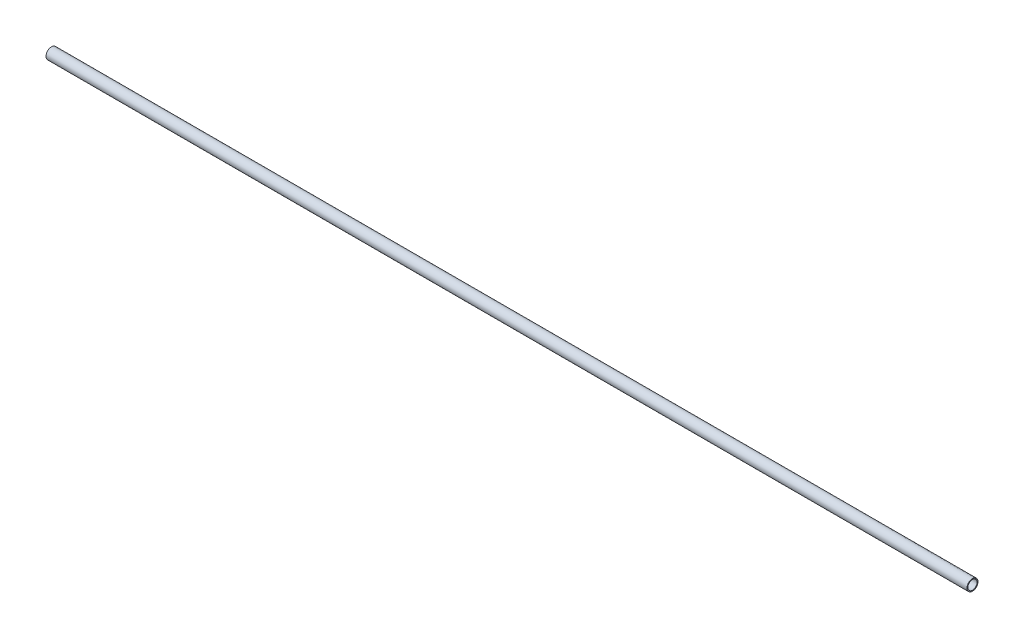
ISO-10303-21;
HEADER;
FILE_DESCRIPTION(('STEP AP214'),'2;1');
FILE_NAME('part.step','',(''),(''),'','','');
FILE_SCHEMA(('AUTOMOTIVE_DESIGN { 1 0 10303 214 1 1 1 1 }'));
ENDSEC;
DATA;
#1=APPLICATION_CONTEXT('core data for automotive mechanical design processes');
#2=APPLICATION_PROTOCOL_DEFINITION('international standard','automotive_design',2000,#1);
#3=PRODUCT_CONTEXT('',#1,'mechanical');
#4=PRODUCT('Part','Part','',(#3));
#5=PRODUCT_RELATED_PRODUCT_CATEGORY('part','',(#4));
#6=PRODUCT_DEFINITION_FORMATION('','',#4);
#7=PRODUCT_DEFINITION_CONTEXT('part definition',#1,'design');
#8=PRODUCT_DEFINITION('design','',#6,#7);
#9=PRODUCT_DEFINITION_SHAPE('','',#8);
#10=(LENGTH_UNIT() NAMED_UNIT(*) SI_UNIT(.MILLI.,.METRE.));
#11=(NAMED_UNIT(*) PLANE_ANGLE_UNIT() SI_UNIT($,.RADIAN.));
#12=(NAMED_UNIT(*) SI_UNIT($,.STERADIAN.) SOLID_ANGLE_UNIT());
#13=UNCERTAINTY_MEASURE_WITH_UNIT(LENGTH_MEASURE(1.E-05),#10,'distance_accuracy_value','');
#14=(GEOMETRIC_REPRESENTATION_CONTEXT(3) GLOBAL_UNCERTAINTY_ASSIGNED_CONTEXT((#13)) GLOBAL_UNIT_ASSIGNED_CONTEXT((#10,
#11,#12)) REPRESENTATION_CONTEXT('',''));
#15=CARTESIAN_POINT('',(0.,0.,0.));
#16=DIRECTION('',(0.,0.,1.));
#17=DIRECTION('',(1.,0.,0.));
#18=AXIS2_PLACEMENT_3D('',#15,#16,#17);
#19=CARTESIAN_POINT('',(500.,0.,0.));
#20=DIRECTION('',(1.,0.,0.));
#21=DIRECTION('',(0.,0.,-1.));
#22=AXIS2_PLACEMENT_3D('',#19,#20,#21);
#23=PLANE('',#22);
#24=CARTESIAN_POINT('',(500.,0.,0.));
#25=DIRECTION('',(1.,0.,0.));
#26=DIRECTION('',(0.,0.,-1.));
#27=AXIS2_PLACEMENT_3D('',#24,#25,#26);
#28=CIRCLE('',#27,6.);
#29=CARTESIAN_POINT('',(500.,0.,-6.));
#30=VERTEX_POINT('',#29);
#31=EDGE_CURVE('E10',#30,#30,#28,.T.);
#32=ORIENTED_EDGE('',*,*,#31,.T.);
#33=EDGE_LOOP('',(#32));
#34=FACE_BOUND('',#33,.T.);
#35=CARTESIAN_POINT('',(500.,0.,0.));
#36=DIRECTION('',(1.,0.,0.));
#37=DIRECTION('',(0.,0.,-1.));
#38=AXIS2_PLACEMENT_3D('',#35,#36,#37);
#39=CIRCLE('',#38,5.);
#40=CARTESIAN_POINT('',(500.,0.,-5.));
#41=VERTEX_POINT('',#40);
#42=EDGE_CURVE('E48',#41,#41,#39,.T.);
#43=ORIENTED_EDGE('',*,*,#42,.F.);
#44=EDGE_LOOP('',(#43));
#45=FACE_BOUND('',#44,.T.);
#46=ADVANCED_FACE('F40',(#34,#45),#23,.T.);
#47=CARTESIAN_POINT('',(-500.,0.,0.));
#48=DIRECTION('',(1.,0.,0.));
#49=DIRECTION('',(0.,0.,-1.));
#50=AXIS2_PLACEMENT_3D('',#47,#48,#49);
#51=PLANE('',#50);
#52=CARTESIAN_POINT('',(-500.,0.,0.));
#53=DIRECTION('',(1.,0.,0.));
#54=DIRECTION('',(0.,0.,-1.));
#55=AXIS2_PLACEMENT_3D('',#52,#53,#54);
#56=CIRCLE('',#55,6.);
#57=CARTESIAN_POINT('',(-500.,0.,-6.));
#58=VERTEX_POINT('',#57);
#59=EDGE_CURVE('E41',#58,#58,#56,.T.);
#60=ORIENTED_EDGE('',*,*,#59,.F.);
#61=EDGE_LOOP('',(#60));
#62=FACE_BOUND('',#61,.T.);
#63=CARTESIAN_POINT('',(-500.,0.,0.));
#64=DIRECTION('',(1.,0.,0.));
#65=DIRECTION('',(0.,0.,-1.));
#66=AXIS2_PLACEMENT_3D('',#63,#64,#65);
#67=CIRCLE('',#66,5.);
#68=CARTESIAN_POINT('',(-500.,0.,-5.));
#69=VERTEX_POINT('',#68);
#70=EDGE_CURVE('E49',#69,#69,#67,.T.);
#71=ORIENTED_EDGE('',*,*,#70,.T.);
#72=EDGE_LOOP('',(#71));
#73=FACE_BOUND('',#72,.T.);
#74=ADVANCED_FACE('F58',(#62,#73),#51,.F.);
#75=CARTESIAN_POINT('',(500.,0.,0.));
#76=DIRECTION('',(-1.,0.,0.));
#77=DIRECTION('',(0.,0.,1.));
#78=AXIS2_PLACEMENT_3D('',#75,#76,#77);
#79=CYLINDRICAL_SURFACE('',#78,6.);
#80=ORIENTED_EDGE('',*,*,#31,.F.);
#81=EDGE_LOOP('',(#80));
#82=FACE_BOUND('',#81,.T.);
#83=ORIENTED_EDGE('',*,*,#59,.T.);
#84=EDGE_LOOP('',(#83));
#85=FACE_BOUND('',#84,.T.);
#86=ADVANCED_FACE('F39',(#82,#85),#79,.T.);
#87=CARTESIAN_POINT('',(500.,0.,0.));
#88=DIRECTION('',(-1.,0.,0.));
#89=DIRECTION('',(0.,0.,1.));
#90=AXIS2_PLACEMENT_3D('',#87,#88,#89);
#91=CYLINDRICAL_SURFACE('',#90,5.);
#92=ORIENTED_EDGE('',*,*,#42,.T.);
#93=EDGE_LOOP('',(#92));
#94=FACE_BOUND('',#93,.T.);
#95=ORIENTED_EDGE('',*,*,#70,.F.);
#96=EDGE_LOOP('',(#95));
#97=FACE_BOUND('',#96,.T.);
#98=ADVANCED_FACE('F57',(#94,#97),#91,.F.);
#99=CLOSED_SHELL('',(#46,#74,#86,#98));
#100=MANIFOLD_SOLID_BREP('B2',#99);
#101=ADVANCED_BREP_SHAPE_REPRESENTATION('',(#18,#100),#14);
#102=SHAPE_DEFINITION_REPRESENTATION(#9,#101);
ENDSEC;
END-ISO-10303-21;
